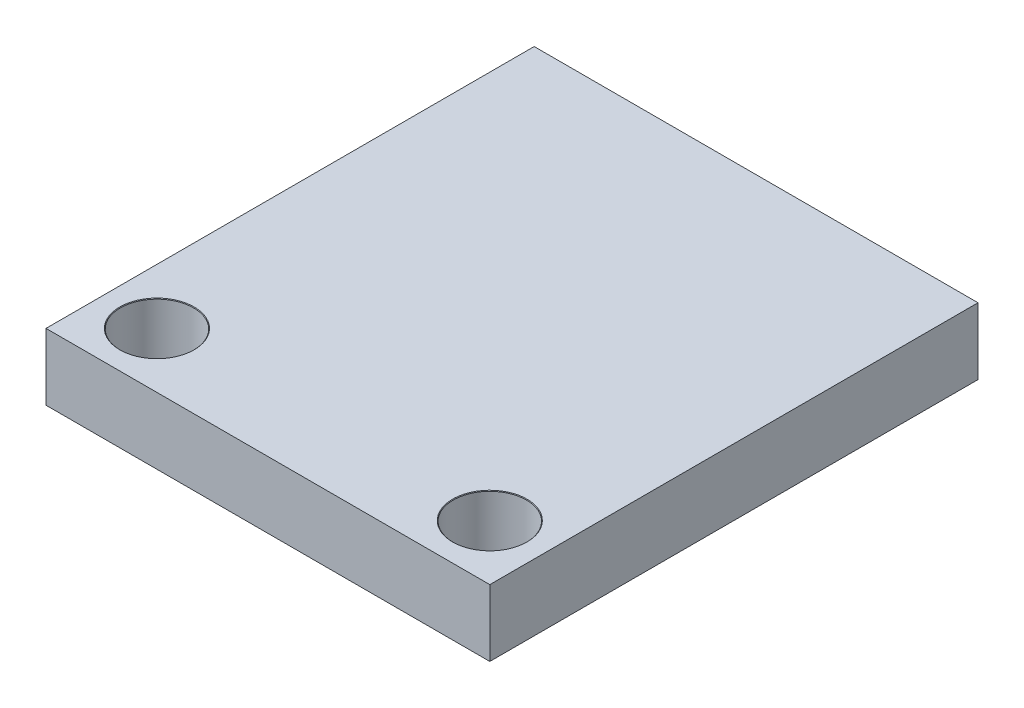
ISO-10303-21;
HEADER;
FILE_DESCRIPTION(('STEP AP214'),'2;1');
FILE_NAME('part.step','',(''),(''),'','','');
FILE_SCHEMA(('AUTOMOTIVE_DESIGN { 1 0 10303 214 1 1 1 1 }'));
ENDSEC;
DATA;
#1=APPLICATION_CONTEXT('core data for automotive mechanical design processes');
#2=APPLICATION_PROTOCOL_DEFINITION('international standard','automotive_design',2000,#1);
#3=PRODUCT_CONTEXT('',#1,'mechanical');
#4=PRODUCT('Part','Part','',(#3));
#5=PRODUCT_RELATED_PRODUCT_CATEGORY('part','',(#4));
#6=PRODUCT_DEFINITION_FORMATION('','',#4);
#7=PRODUCT_DEFINITION_CONTEXT('part definition',#1,'design');
#8=PRODUCT_DEFINITION('design','',#6,#7);
#9=PRODUCT_DEFINITION_SHAPE('','',#8);
#10=(LENGTH_UNIT() NAMED_UNIT(*) SI_UNIT(.MILLI.,.METRE.));
#11=(NAMED_UNIT(*) PLANE_ANGLE_UNIT() SI_UNIT($,.RADIAN.));
#12=(NAMED_UNIT(*) SI_UNIT($,.STERADIAN.) SOLID_ANGLE_UNIT());
#13=UNCERTAINTY_MEASURE_WITH_UNIT(LENGTH_MEASURE(1.E-05),#10,'distance_accuracy_value','');
#14=(GEOMETRIC_REPRESENTATION_CONTEXT(3) GLOBAL_UNCERTAINTY_ASSIGNED_CONTEXT((#13)) GLOBAL_UNIT_ASSIGNED_CONTEXT((#10,
#11,#12)) REPRESENTATION_CONTEXT('',''));
#15=CARTESIAN_POINT('',(0.,0.,0.));
#16=DIRECTION('',(0.,0.,1.));
#17=DIRECTION('',(1.,0.,0.));
#18=AXIS2_PLACEMENT_3D('',#15,#16,#17);
#19=CARTESIAN_POINT('',(10.,3.,-11.));
#20=DIRECTION('',(-1.,0.,0.));
#21=DIRECTION('',(0.,0.,1.));
#22=AXIS2_PLACEMENT_3D('',#19,#20,#21);
#23=PLANE('',#22);
#24=DIRECTION('',(0.,0.,-1.));
#25=VECTOR('',#24,1.);
#26=CARTESIAN_POINT('',(10.,0.,-11.));
#27=LINE('',#26,#25);
#28=CARTESIAN_POINT('',(10.,0.,11.));
#29=VERTEX_POINT('',#28);
#30=CARTESIAN_POINT('',(10.,0.,-11.));
#31=VERTEX_POINT('',#30);
#32=EDGE_CURVE('E96',#29,#31,#27,.T.);
#33=ORIENTED_EDGE('',*,*,#32,.T.);
#34=DIRECTION('',(0.,-1.,0.));
#35=VECTOR('',#34,1.);
#36=CARTESIAN_POINT('',(10.,3.,-11.));
#37=LINE('',#36,#35);
#38=CARTESIAN_POINT('',(10.,3.,-11.));
#39=VERTEX_POINT('',#38);
#40=EDGE_CURVE('E11',#39,#31,#37,.T.);
#41=ORIENTED_EDGE('',*,*,#40,.F.);
#42=DIRECTION('',(0.,0.,-1.));
#43=VECTOR('',#42,1.);
#44=CARTESIAN_POINT('',(10.,3.,-11.));
#45=LINE('',#44,#43);
#46=CARTESIAN_POINT('',(10.,3.,11.));
#47=VERTEX_POINT('',#46);
#48=EDGE_CURVE('E84',#47,#39,#45,.T.);
#49=ORIENTED_EDGE('',*,*,#48,.F.);
#50=DIRECTION('',(0.,-1.,0.));
#51=VECTOR('',#50,1.);
#52=CARTESIAN_POINT('',(10.,3.,11.));
#53=LINE('',#52,#51);
#54=EDGE_CURVE('E92',#47,#29,#53,.T.);
#55=ORIENTED_EDGE('',*,*,#54,.T.);
#56=EDGE_LOOP('',(#33,#41,#49,#55));
#57=FACE_BOUND('',#56,.T.);
#58=ADVANCED_FACE('F33',(#57),#23,.F.);
#59=CARTESIAN_POINT('',(-10.,3.,-11.));
#60=DIRECTION('',(0.,0.,1.));
#61=DIRECTION('',(1.,0.,0.));
#62=AXIS2_PLACEMENT_3D('',#59,#60,#61);
#63=PLANE('',#62);
#64=DIRECTION('',(-1.,0.,0.));
#65=VECTOR('',#64,1.);
#66=CARTESIAN_POINT('',(-10.,0.,-11.));
#67=LINE('',#66,#65);
#68=CARTESIAN_POINT('',(-10.,0.,-11.));
#69=VERTEX_POINT('',#68);
#70=EDGE_CURVE('E88',#31,#69,#67,.T.);
#71=ORIENTED_EDGE('',*,*,#70,.T.);
#72=DIRECTION('',(0.,-1.,0.));
#73=VECTOR('',#72,1.);
#74=CARTESIAN_POINT('',(-10.,3.,-11.));
#75=LINE('',#74,#73);
#76=CARTESIAN_POINT('',(-10.,3.,-11.));
#77=VERTEX_POINT('',#76);
#78=EDGE_CURVE('E41',#77,#69,#75,.T.);
#79=ORIENTED_EDGE('',*,*,#78,.F.);
#80=DIRECTION('',(-1.,0.,0.));
#81=VECTOR('',#80,1.);
#82=CARTESIAN_POINT('',(-10.,3.,-11.));
#83=LINE('',#82,#81);
#84=EDGE_CURVE('E79',#39,#77,#83,.T.);
#85=ORIENTED_EDGE('',*,*,#84,.F.);
#86=ORIENTED_EDGE('',*,*,#40,.T.);
#87=EDGE_LOOP('',(#71,#79,#85,#86));
#88=FACE_BOUND('',#87,.T.);
#89=ADVANCED_FACE('F87',(#88),#63,.F.);
#90=CARTESIAN_POINT('',(-10.,3.,-11.));
#91=DIRECTION('',(1.,0.,0.));
#92=DIRECTION('',(0.,0.,-1.));
#93=AXIS2_PLACEMENT_3D('',#90,#91,#92);
#94=PLANE('',#93);
#95=DIRECTION('',(0.,0.,1.));
#96=VECTOR('',#95,1.);
#97=CARTESIAN_POINT('',(-10.,0.,-11.));
#98=LINE('',#97,#96);
#99=CARTESIAN_POINT('',(-10.,0.,11.));
#100=VERTEX_POINT('',#99);
#101=EDGE_CURVE('E66',#69,#100,#98,.T.);
#102=ORIENTED_EDGE('',*,*,#101,.T.);
#103=DIRECTION('',(0.,-1.,0.));
#104=VECTOR('',#103,1.);
#105=CARTESIAN_POINT('',(-10.,3.,11.));
#106=LINE('',#105,#104);
#107=CARTESIAN_POINT('',(-10.,3.,11.));
#108=VERTEX_POINT('',#107);
#109=EDGE_CURVE('E89',#108,#100,#106,.T.);
#110=ORIENTED_EDGE('',*,*,#109,.F.);
#111=DIRECTION('',(0.,0.,1.));
#112=VECTOR('',#111,1.);
#113=CARTESIAN_POINT('',(-10.,3.,-11.));
#114=LINE('',#113,#112);
#115=EDGE_CURVE('E82',#77,#108,#114,.T.);
#116=ORIENTED_EDGE('',*,*,#115,.F.);
#117=ORIENTED_EDGE('',*,*,#78,.T.);
#118=EDGE_LOOP('',(#102,#110,#116,#117));
#119=FACE_BOUND('',#118,.T.);
#120=ADVANCED_FACE('F90',(#119),#94,.F.);
#121=CARTESIAN_POINT('',(-10.,3.,11.));
#122=DIRECTION('',(0.,0.,-1.));
#123=DIRECTION('',(-1.,0.,0.));
#124=AXIS2_PLACEMENT_3D('',#121,#122,#123);
#125=PLANE('',#124);
#126=DIRECTION('',(1.,0.,0.));
#127=VECTOR('',#126,1.);
#128=CARTESIAN_POINT('',(-10.,0.,11.));
#129=LINE('',#128,#127);
#130=EDGE_CURVE('E72',#100,#29,#129,.T.);
#131=ORIENTED_EDGE('',*,*,#130,.T.);
#132=ORIENTED_EDGE('',*,*,#54,.F.);
#133=DIRECTION('',(1.,0.,0.));
#134=VECTOR('',#133,1.);
#135=CARTESIAN_POINT('',(-10.,3.,11.));
#136=LINE('',#135,#134);
#137=EDGE_CURVE('E49',#108,#47,#136,.T.);
#138=ORIENTED_EDGE('',*,*,#137,.F.);
#139=ORIENTED_EDGE('',*,*,#109,.T.);
#140=EDGE_LOOP('',(#131,#132,#138,#139));
#141=FACE_BOUND('',#140,.T.);
#142=ADVANCED_FACE('F104',(#141),#125,.F.);
#143=CARTESIAN_POINT('',(0.,3.,0.));
#144=DIRECTION('',(0.,1.,0.));
#145=DIRECTION('',(0.,0.,1.));
#146=AXIS2_PLACEMENT_3D('',#143,#144,#145);
#147=PLANE('',#146);
#148=CARTESIAN_POINT('',(-7.5,3.,8.5));
#149=DIRECTION('',(0.,1.,0.));
#150=DIRECTION('',(0.,0.,1.));
#151=AXIS2_PLACEMENT_3D('',#148,#149,#150);
#152=CIRCLE('',#151,1.675);
#153=CARTESIAN_POINT('',(-7.5,3.,10.175));
#154=VERTEX_POINT('',#153);
#155=EDGE_CURVE('E124',#154,#154,#152,.T.);
#156=ORIENTED_EDGE('',*,*,#155,.F.);
#157=EDGE_LOOP('',(#156));
#158=FACE_BOUND('',#157,.T.);
#159=CARTESIAN_POINT('',(7.5,3.,8.5));
#160=DIRECTION('',(0.,1.,0.));
#161=DIRECTION('',(0.,0.,1.));
#162=AXIS2_PLACEMENT_3D('',#159,#160,#161);
#163=CIRCLE('',#162,1.675);
#164=CARTESIAN_POINT('',(7.5,3.,10.175));
#165=VERTEX_POINT('',#164);
#166=EDGE_CURVE('E115',#165,#165,#163,.T.);
#167=ORIENTED_EDGE('',*,*,#166,.F.);
#168=EDGE_LOOP('',(#167));
#169=FACE_BOUND('',#168,.T.);
#170=ORIENTED_EDGE('',*,*,#48,.T.);
#171=ORIENTED_EDGE('',*,*,#84,.T.);
#172=ORIENTED_EDGE('',*,*,#115,.T.);
#173=ORIENTED_EDGE('',*,*,#137,.T.);
#174=EDGE_LOOP('',(#170,#171,#172,#173));
#175=FACE_BOUND('',#174,.T.);
#176=ADVANCED_FACE('F80',(#158,#169,#175),#147,.T.);
#177=CARTESIAN_POINT('',(0.,0.,0.));
#178=DIRECTION('',(0.,1.,0.));
#179=DIRECTION('',(0.,0.,1.));
#180=AXIS2_PLACEMENT_3D('',#177,#178,#179);
#181=PLANE('',#180);
#182=CARTESIAN_POINT('',(-7.5,0.,8.5));
#183=DIRECTION('',(0.,1.,0.));
#184=DIRECTION('',(0.,0.,1.));
#185=AXIS2_PLACEMENT_3D('',#182,#183,#184);
#186=CIRCLE('',#185,1.65);
#187=CARTESIAN_POINT('',(-7.5,0.,10.15));
#188=VERTEX_POINT('',#187);
#189=EDGE_CURVE('E118',#188,#188,#186,.T.);
#190=ORIENTED_EDGE('',*,*,#189,.T.);
#191=EDGE_LOOP('',(#190));
#192=FACE_BOUND('',#191,.T.);
#193=CARTESIAN_POINT('',(7.5,0.,8.5));
#194=DIRECTION('',(0.,1.,0.));
#195=DIRECTION('',(0.,0.,1.));
#196=AXIS2_PLACEMENT_3D('',#193,#194,#195);
#197=CIRCLE('',#196,1.64999999999999);
#198=CARTESIAN_POINT('',(7.5,0.,10.15));
#199=VERTEX_POINT('',#198);
#200=EDGE_CURVE('E99',#199,#199,#197,.T.);
#201=ORIENTED_EDGE('',*,*,#200,.T.);
#202=EDGE_LOOP('',(#201));
#203=FACE_BOUND('',#202,.T.);
#204=ORIENTED_EDGE('',*,*,#32,.F.);
#205=ORIENTED_EDGE('',*,*,#130,.F.);
#206=ORIENTED_EDGE('',*,*,#101,.F.);
#207=ORIENTED_EDGE('',*,*,#70,.F.);
#208=EDGE_LOOP('',(#204,#205,#206,#207));
#209=FACE_BOUND('',#208,.T.);
#210=ADVANCED_FACE('F107',(#192,#203,#209),#181,.F.);
#211=CARTESIAN_POINT('',(7.5,3.,8.5));
#212=DIRECTION('',(0.,1.,0.));
#213=DIRECTION('',(0.,0.,1.));
#214=AXIS2_PLACEMENT_3D('',#211,#212,#213);
#215=CYLINDRICAL_SURFACE('',#214,1.64999999999999);
#216=ORIENTED_EDGE('',*,*,#200,.F.);
#217=EDGE_LOOP('',(#216));
#218=FACE_BOUND('',#217,.T.);
#219=CARTESIAN_POINT('',(7.5,2.975,8.5));
#220=DIRECTION('',(0.,1.,0.));
#221=DIRECTION('',(0.,0.,1.));
#222=AXIS2_PLACEMENT_3D('',#219,#220,#221);
#223=CIRCLE('',#222,1.64999999999999);
#224=CARTESIAN_POINT('',(7.5,2.975,10.15));
#225=VERTEX_POINT('',#224);
#226=EDGE_CURVE('E112',#225,#225,#223,.T.);
#227=ORIENTED_EDGE('',*,*,#226,.T.);
#228=EDGE_LOOP('',(#227));
#229=FACE_BOUND('',#228,.T.);
#230=ADVANCED_FACE('F138',(#218,#229),#215,.F.);
#231=CARTESIAN_POINT('',(7.5,3.,8.5));
#232=DIRECTION('',(0.,1.,0.));
#233=DIRECTION('',(0.,0.,1.));
#234=AXIS2_PLACEMENT_3D('',#231,#232,#233);
#235=CONICAL_SURFACE('',#234,1.675,0.785398163397691);
#236=ORIENTED_EDGE('',*,*,#226,.F.);
#237=EDGE_LOOP('',(#236));
#238=FACE_BOUND('',#237,.T.);
#239=ORIENTED_EDGE('',*,*,#166,.T.);
#240=EDGE_LOOP('',(#239));
#241=FACE_BOUND('',#240,.T.);
#242=ADVANCED_FACE('F135',(#238,#241),#235,.F.);
#243=CARTESIAN_POINT('',(-7.5,3.,8.5));
#244=DIRECTION('',(0.,1.,0.));
#245=DIRECTION('',(0.,0.,1.));
#246=AXIS2_PLACEMENT_3D('',#243,#244,#245);
#247=CYLINDRICAL_SURFACE('',#246,1.64999999999999);
#248=ORIENTED_EDGE('',*,*,#189,.F.);
#249=EDGE_LOOP('',(#248));
#250=FACE_BOUND('',#249,.T.);
#251=CARTESIAN_POINT('',(-7.5,2.975,8.5));
#252=DIRECTION('',(0.,1.,0.));
#253=DIRECTION('',(0.,0.,1.));
#254=AXIS2_PLACEMENT_3D('',#251,#252,#253);
#255=CIRCLE('',#254,1.64999999999999);
#256=CARTESIAN_POINT('',(-7.5,2.975,10.15));
#257=VERTEX_POINT('',#256);
#258=EDGE_CURVE('E121',#257,#257,#255,.T.);
#259=ORIENTED_EDGE('',*,*,#258,.T.);
#260=EDGE_LOOP('',(#259));
#261=FACE_BOUND('',#260,.T.);
#262=ADVANCED_FACE('F137',(#250,#261),#247,.F.);
#263=CARTESIAN_POINT('',(-7.5,3.,8.5));
#264=DIRECTION('',(0.,1.,0.));
#265=DIRECTION('',(0.,0.,1.));
#266=AXIS2_PLACEMENT_3D('',#263,#264,#265);
#267=CONICAL_SURFACE('',#266,1.675,0.785398163397691);
#268=ORIENTED_EDGE('',*,*,#258,.F.);
#269=EDGE_LOOP('',(#268));
#270=FACE_BOUND('',#269,.T.);
#271=ORIENTED_EDGE('',*,*,#155,.T.);
#272=EDGE_LOOP('',(#271));
#273=FACE_BOUND('',#272,.T.);
#274=ADVANCED_FACE('F128',(#270,#273),#267,.F.);
#275=CLOSED_SHELL('',(#58,#89,#120,#142,#176,#210,#230,#242,#262,#274));
#276=MANIFOLD_SOLID_BREP('B2',#275);
#277=ADVANCED_BREP_SHAPE_REPRESENTATION('',(#18,#276),#14);
#278=SHAPE_DEFINITION_REPRESENTATION(#9,#277);
ENDSEC;
END-ISO-10303-21;
